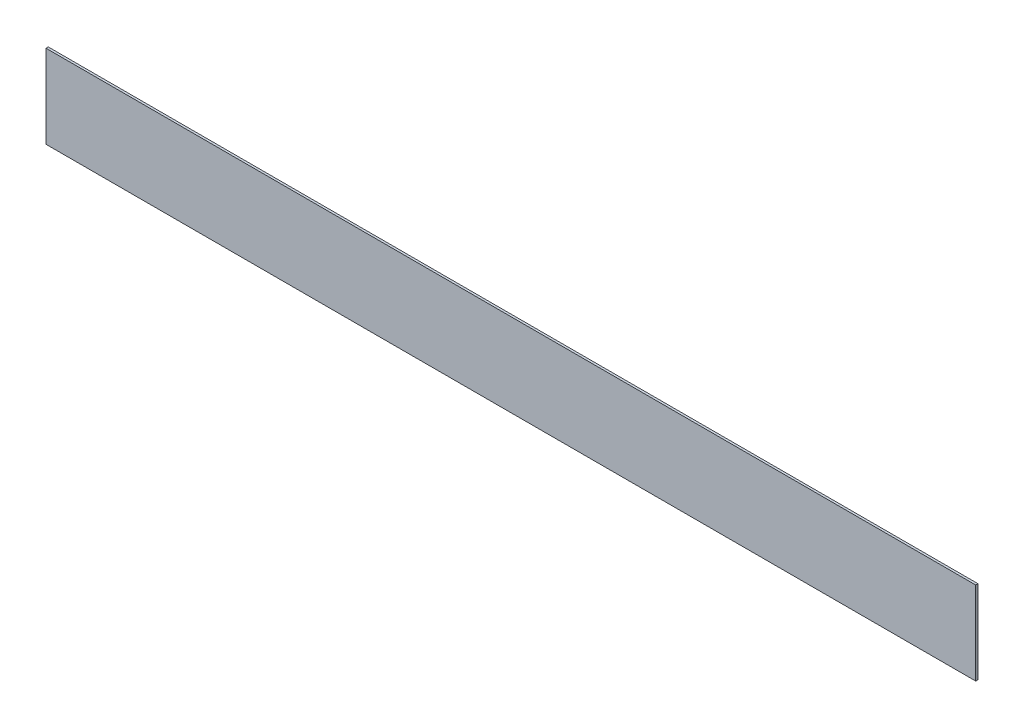
ISO-10303-21;
HEADER;
FILE_DESCRIPTION(('STEP AP214'),'2;1');
FILE_NAME('part.step','',(''),(''),'','','');
FILE_SCHEMA(('AUTOMOTIVE_DESIGN { 1 0 10303 214 1 1 1 1 }'));
ENDSEC;
DATA;
#1=APPLICATION_CONTEXT('core data for automotive mechanical design processes');
#2=APPLICATION_PROTOCOL_DEFINITION('international standard','automotive_design',2000,#1);
#3=PRODUCT_CONTEXT('',#1,'mechanical');
#4=PRODUCT('Part','Part','',(#3));
#5=PRODUCT_RELATED_PRODUCT_CATEGORY('part','',(#4));
#6=PRODUCT_DEFINITION_FORMATION('','',#4);
#7=PRODUCT_DEFINITION_CONTEXT('part definition',#1,'design');
#8=PRODUCT_DEFINITION('design','',#6,#7);
#9=PRODUCT_DEFINITION_SHAPE('','',#8);
#10=(LENGTH_UNIT() NAMED_UNIT(*) SI_UNIT(.MILLI.,.METRE.));
#11=(NAMED_UNIT(*) PLANE_ANGLE_UNIT() SI_UNIT($,.RADIAN.));
#12=(NAMED_UNIT(*) SI_UNIT($,.STERADIAN.) SOLID_ANGLE_UNIT());
#13=UNCERTAINTY_MEASURE_WITH_UNIT(LENGTH_MEASURE(1.E-05),#10,'distance_accuracy_value','');
#14=(GEOMETRIC_REPRESENTATION_CONTEXT(3) GLOBAL_UNCERTAINTY_ASSIGNED_CONTEXT((#13)) GLOBAL_UNIT_ASSIGNED_CONTEXT((#10,
#11,#12)) REPRESENTATION_CONTEXT('',''));
#15=CARTESIAN_POINT('',(0.,0.,0.));
#16=DIRECTION('',(0.,0.,1.));
#17=DIRECTION('',(1.,0.,0.));
#18=AXIS2_PLACEMENT_3D('',#15,#16,#17);
#19=CARTESIAN_POINT('',(0.,0.,5.));
#20=DIRECTION('',(1.,0.,0.));
#21=DIRECTION('',(0.,0.,-1.));
#22=AXIS2_PLACEMENT_3D('',#19,#20,#21);
#23=PLANE('',#22);
#24=DIRECTION('',(0.,-1.,0.));
#25=VECTOR('',#24,1.);
#26=CARTESIAN_POINT('',(0.,0.,0.));
#27=LINE('',#26,#25);
#28=CARTESIAN_POINT('',(0.,184.,0.));
#29=VERTEX_POINT('',#28);
#30=CARTESIAN_POINT('',(0.,0.,0.));
#31=VERTEX_POINT('',#30);
#32=EDGE_CURVE('E97',#29,#31,#27,.T.);
#33=ORIENTED_EDGE('',*,*,#32,.T.);
#34=DIRECTION('',(0.,0.,-1.));
#35=VECTOR('',#34,1.);
#36=CARTESIAN_POINT('',(0.,0.,5.));
#37=LINE('',#36,#35);
#38=CARTESIAN_POINT('',(0.,0.,5.));
#39=VERTEX_POINT('',#38);
#40=EDGE_CURVE('E11',#39,#31,#37,.T.);
#41=ORIENTED_EDGE('',*,*,#40,.F.);
#42=DIRECTION('',(0.,-1.,0.));
#43=VECTOR('',#42,1.);
#44=CARTESIAN_POINT('',(0.,0.,5.));
#45=LINE('',#44,#43);
#46=CARTESIAN_POINT('',(0.,184.,5.));
#47=VERTEX_POINT('',#46);
#48=EDGE_CURVE('E85',#47,#39,#45,.T.);
#49=ORIENTED_EDGE('',*,*,#48,.F.);
#50=DIRECTION('',(0.,0.,-1.));
#51=VECTOR('',#50,1.);
#52=CARTESIAN_POINT('',(0.,184.,5.));
#53=LINE('',#52,#51);
#54=EDGE_CURVE('E93',#47,#29,#53,.T.);
#55=ORIENTED_EDGE('',*,*,#54,.T.);
#56=EDGE_LOOP('',(#33,#41,#49,#55));
#57=FACE_BOUND('',#56,.T.);
#58=ADVANCED_FACE('F34',(#57),#23,.F.);
#59=CARTESIAN_POINT('',(0.,0.,5.));
#60=DIRECTION('',(0.,1.,0.));
#61=DIRECTION('',(0.,0.,1.));
#62=AXIS2_PLACEMENT_3D('',#59,#60,#61);
#63=PLANE('',#62);
#64=DIRECTION('',(1.,0.,0.));
#65=VECTOR('',#64,1.);
#66=CARTESIAN_POINT('',(0.,0.,0.));
#67=LINE('',#66,#65);
#68=CARTESIAN_POINT('',(2056.,0.,0.));
#69=VERTEX_POINT('',#68);
#70=EDGE_CURVE('E89',#31,#69,#67,.T.);
#71=ORIENTED_EDGE('',*,*,#70,.T.);
#72=DIRECTION('',(0.,0.,-1.));
#73=VECTOR('',#72,1.);
#74=CARTESIAN_POINT('',(2056.,0.,5.));
#75=LINE('',#74,#73);
#76=CARTESIAN_POINT('',(2056.,0.,5.));
#77=VERTEX_POINT('',#76);
#78=EDGE_CURVE('E42',#77,#69,#75,.T.);
#79=ORIENTED_EDGE('',*,*,#78,.F.);
#80=DIRECTION('',(1.,0.,0.));
#81=VECTOR('',#80,1.);
#82=CARTESIAN_POINT('',(0.,0.,5.));
#83=LINE('',#82,#81);
#84=EDGE_CURVE('E80',#39,#77,#83,.T.);
#85=ORIENTED_EDGE('',*,*,#84,.F.);
#86=ORIENTED_EDGE('',*,*,#40,.T.);
#87=EDGE_LOOP('',(#71,#79,#85,#86));
#88=FACE_BOUND('',#87,.T.);
#89=ADVANCED_FACE('F88',(#88),#63,.F.);
#90=CARTESIAN_POINT('',(2056.,0.,5.));
#91=DIRECTION('',(-1.,0.,0.));
#92=DIRECTION('',(0.,0.,1.));
#93=AXIS2_PLACEMENT_3D('',#90,#91,#92);
#94=PLANE('',#93);
#95=DIRECTION('',(0.,1.,0.));
#96=VECTOR('',#95,1.);
#97=CARTESIAN_POINT('',(2056.,0.,0.));
#98=LINE('',#97,#96);
#99=CARTESIAN_POINT('',(2056.,184.,0.));
#100=VERTEX_POINT('',#99);
#101=EDGE_CURVE('E67',#69,#100,#98,.T.);
#102=ORIENTED_EDGE('',*,*,#101,.T.);
#103=DIRECTION('',(0.,0.,-1.));
#104=VECTOR('',#103,1.);
#105=CARTESIAN_POINT('',(2056.,184.,5.));
#106=LINE('',#105,#104);
#107=CARTESIAN_POINT('',(2056.,184.,5.));
#108=VERTEX_POINT('',#107);
#109=EDGE_CURVE('E90',#108,#100,#106,.T.);
#110=ORIENTED_EDGE('',*,*,#109,.F.);
#111=DIRECTION('',(0.,1.,0.));
#112=VECTOR('',#111,1.);
#113=CARTESIAN_POINT('',(2056.,0.,5.));
#114=LINE('',#113,#112);
#115=EDGE_CURVE('E83',#77,#108,#114,.T.);
#116=ORIENTED_EDGE('',*,*,#115,.F.);
#117=ORIENTED_EDGE('',*,*,#78,.T.);
#118=EDGE_LOOP('',(#102,#110,#116,#117));
#119=FACE_BOUND('',#118,.T.);
#120=ADVANCED_FACE('F91',(#119),#94,.F.);
#121=CARTESIAN_POINT('',(0.,184.,5.));
#122=DIRECTION('',(0.,-1.,0.));
#123=DIRECTION('',(0.,0.,-1.));
#124=AXIS2_PLACEMENT_3D('',#121,#122,#123);
#125=PLANE('',#124);
#126=DIRECTION('',(-1.,0.,0.));
#127=VECTOR('',#126,1.);
#128=CARTESIAN_POINT('',(0.,184.,0.));
#129=LINE('',#128,#127);
#130=EDGE_CURVE('E73',#100,#29,#129,.T.);
#131=ORIENTED_EDGE('',*,*,#130,.T.);
#132=ORIENTED_EDGE('',*,*,#54,.F.);
#133=DIRECTION('',(-1.,0.,0.));
#134=VECTOR('',#133,1.);
#135=CARTESIAN_POINT('',(0.,184.,5.));
#136=LINE('',#135,#134);
#137=EDGE_CURVE('E50',#108,#47,#136,.T.);
#138=ORIENTED_EDGE('',*,*,#137,.F.);
#139=ORIENTED_EDGE('',*,*,#109,.T.);
#140=EDGE_LOOP('',(#131,#132,#138,#139));
#141=FACE_BOUND('',#140,.T.);
#142=ADVANCED_FACE('F104',(#141),#125,.F.);
#143=CARTESIAN_POINT('',(0.,0.,5.));
#144=DIRECTION('',(0.,0.,-1.));
#145=DIRECTION('',(-1.,0.,0.));
#146=AXIS2_PLACEMENT_3D('',#143,#144,#145);
#147=PLANE('',#146);
#148=ORIENTED_EDGE('',*,*,#48,.T.);
#149=ORIENTED_EDGE('',*,*,#84,.T.);
#150=ORIENTED_EDGE('',*,*,#115,.T.);
#151=ORIENTED_EDGE('',*,*,#137,.T.);
#152=EDGE_LOOP('',(#148,#149,#150,#151));
#153=FACE_BOUND('',#152,.T.);
#154=ADVANCED_FACE('F81',(#153),#147,.F.);
#155=CARTESIAN_POINT('',(0.,0.,0.));
#156=DIRECTION('',(0.,0.,-1.));
#157=DIRECTION('',(-1.,0.,0.));
#158=AXIS2_PLACEMENT_3D('',#155,#156,#157);
#159=PLANE('',#158);
#160=ORIENTED_EDGE('',*,*,#32,.F.);
#161=ORIENTED_EDGE('',*,*,#130,.F.);
#162=ORIENTED_EDGE('',*,*,#101,.F.);
#163=ORIENTED_EDGE('',*,*,#70,.F.);
#164=EDGE_LOOP('',(#160,#161,#162,#163));
#165=FACE_BOUND('',#164,.T.);
#166=ADVANCED_FACE('F107',(#165),#159,.T.);
#167=CLOSED_SHELL('',(#58,#89,#120,#142,#154,#166));
#168=MANIFOLD_SOLID_BREP('B2',#167);
#169=ADVANCED_BREP_SHAPE_REPRESENTATION('',(#18,#168),#14);
#170=SHAPE_DEFINITION_REPRESENTATION(#9,#169);
ENDSEC;
END-ISO-10303-21;
